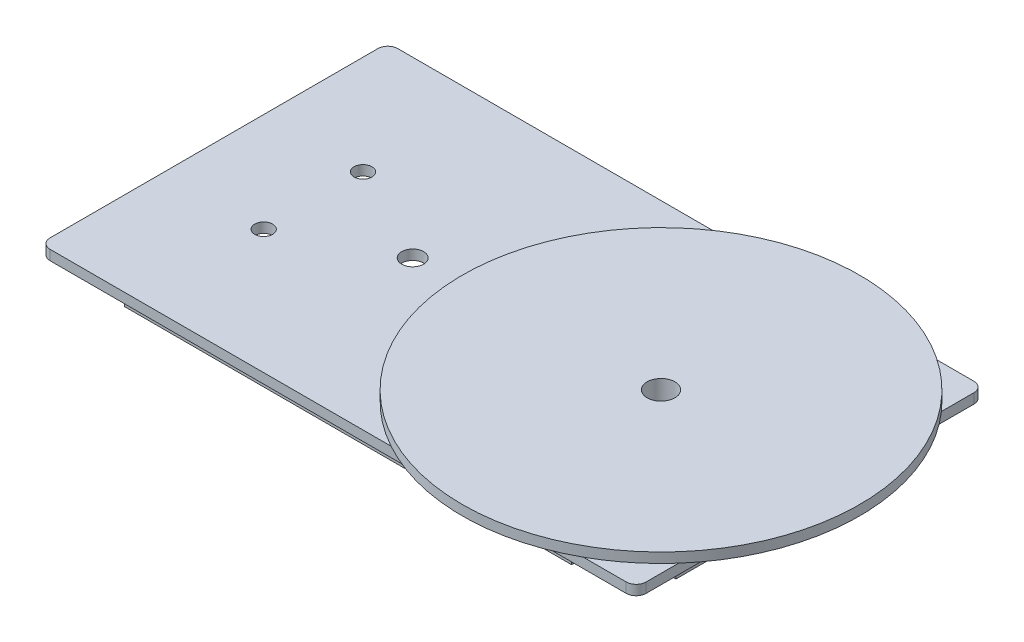
ISO-10303-21;
HEADER;
FILE_DESCRIPTION(('STEP AP214'),'2;1');
FILE_NAME('part.step','',(''),(''),'','','');
FILE_SCHEMA(('AUTOMOTIVE_DESIGN { 1 0 10303 214 1 1 1 1 }'));
ENDSEC;
DATA;
#1=APPLICATION_CONTEXT('core data for automotive mechanical design processes');
#2=APPLICATION_PROTOCOL_DEFINITION('international standard','automotive_design',2000,#1);
#3=PRODUCT_CONTEXT('',#1,'mechanical');
#4=PRODUCT('Part','Part','',(#3));
#5=PRODUCT_RELATED_PRODUCT_CATEGORY('part','',(#4));
#6=PRODUCT_DEFINITION_FORMATION('','',#4);
#7=PRODUCT_DEFINITION_CONTEXT('part definition',#1,'design');
#8=PRODUCT_DEFINITION('design','',#6,#7);
#9=PRODUCT_DEFINITION_SHAPE('','',#8);
#10=(LENGTH_UNIT() NAMED_UNIT(*) SI_UNIT(.MILLI.,.METRE.));
#11=(NAMED_UNIT(*) PLANE_ANGLE_UNIT() SI_UNIT($,.RADIAN.));
#12=(NAMED_UNIT(*) SI_UNIT($,.STERADIAN.) SOLID_ANGLE_UNIT());
#13=UNCERTAINTY_MEASURE_WITH_UNIT(LENGTH_MEASURE(1.E-05),#10,'distance_accuracy_value','');
#14=(GEOMETRIC_REPRESENTATION_CONTEXT(3) GLOBAL_UNCERTAINTY_ASSIGNED_CONTEXT((#13)) GLOBAL_UNIT_ASSIGNED_CONTEXT((#10,
#11,#12)) REPRESENTATION_CONTEXT('',''));
#15=CARTESIAN_POINT('',(0.,0.,0.));
#16=DIRECTION('',(0.,0.,1.));
#17=DIRECTION('',(1.,0.,0.));
#18=AXIS2_PLACEMENT_3D('',#15,#16,#17);
#19=CARTESIAN_POINT('',(0.,2.54,0.));
#20=DIRECTION('',(0.,-1.,0.));
#21=DIRECTION('',(0.,0.,-1.));
#22=AXIS2_PLACEMENT_3D('',#19,#20,#21);
#23=PLANE('',#22);
#24=CARTESIAN_POINT('',(38.1,2.54,0.));
#25=DIRECTION('',(0.,1.,0.));
#26=DIRECTION('',(0.,0.,1.));
#27=AXIS2_PLACEMENT_3D('',#24,#25,#26);
#28=CIRCLE('',#27,50.8);
#29=CARTESIAN_POINT('',(62.6934442484172,2.54,44.45));
#30=VERTEX_POINT('',#29);
#31=CARTESIAN_POINT('',(76.2,2.54,33.6010416505203));
#32=VERTEX_POINT('',#31);
#33=EDGE_CURVE('E283',#30,#32,#28,.T.);
#34=ORIENTED_EDGE('',*,*,#33,.F.);
#35=DIRECTION('',(1.,0.,0.));
#36=VECTOR('',#35,1.);
#37=CARTESIAN_POINT('',(-76.2,2.54,44.45));
#38=LINE('',#37,#36);
#39=CARTESIAN_POINT('',(73.6599999999999,2.54,44.45));
#40=VERTEX_POINT('',#39);
#41=EDGE_CURVE('E266',#30,#40,#38,.T.);
#42=ORIENTED_EDGE('',*,*,#41,.T.);
#43=CARTESIAN_POINT('',(73.66,2.54,41.91));
#44=DIRECTION('',(0.,-1.,0.));
#45=DIRECTION('',(0.,0.,-1.));
#46=AXIS2_PLACEMENT_3D('',#43,#44,#45);
#47=CIRCLE('',#46,2.54);
#48=CARTESIAN_POINT('',(76.2,2.54,41.91));
#49=VERTEX_POINT('',#48);
#50=EDGE_CURVE('E384',#40,#49,#47,.F.);
#51=ORIENTED_EDGE('',*,*,#50,.T.);
#52=DIRECTION('',(0.,0.,-1.));
#53=VECTOR('',#52,1.);
#54=CARTESIAN_POINT('',(76.2,2.54,44.45));
#55=LINE('',#54,#53);
#56=EDGE_CURVE('E422',#49,#32,#55,.T.);
#57=ORIENTED_EDGE('',*,*,#56,.T.);
#58=EDGE_LOOP('',(#34,#42,#51,#57));
#59=FACE_BOUND('',#58,.T.);
#60=ADVANCED_FACE('F68',(#59),#23,.F.);
#61=CARTESIAN_POINT('',(76.2,2.54,-33.6010416505203));
#62=VERTEX_POINT('',#61);
#63=CARTESIAN_POINT('',(62.6934442484171,2.54,-44.45));
#64=VERTEX_POINT('',#63);
#65=EDGE_CURVE('E12',#62,#64,#28,.T.);
#66=ORIENTED_EDGE('',*,*,#65,.F.);
#67=CARTESIAN_POINT('',(76.2,2.54,-41.91));
#68=VERTEX_POINT('',#67);
#69=EDGE_CURVE('E416',#62,#68,#55,.T.);
#70=ORIENTED_EDGE('',*,*,#69,.T.);
#71=CARTESIAN_POINT('',(73.66,2.54,-41.91));
#72=DIRECTION('',(0.,-1.,0.));
#73=DIRECTION('',(0.,0.,-1.));
#74=AXIS2_PLACEMENT_3D('',#71,#72,#73);
#75=CIRCLE('',#74,2.54);
#76=CARTESIAN_POINT('',(73.6599999999999,2.54,-44.45));
#77=VERTEX_POINT('',#76);
#78=EDGE_CURVE('E388',#68,#77,#75,.F.);
#79=ORIENTED_EDGE('',*,*,#78,.T.);
#80=DIRECTION('',(-1.,0.,0.));
#81=VECTOR('',#80,1.);
#82=CARTESIAN_POINT('',(-76.2,2.54,-44.45));
#83=LINE('',#82,#81);
#84=EDGE_CURVE('E459',#77,#64,#83,.T.);
#85=ORIENTED_EDGE('',*,*,#84,.T.);
#86=EDGE_LOOP('',(#66,#70,#79,#85));
#87=FACE_BOUND('',#86,.T.);
#88=ADVANCED_FACE('F331',(#87),#23,.F.);
#89=CARTESIAN_POINT('',(0.,0.,0.));
#90=DIRECTION('',(0.,-1.,0.));
#91=DIRECTION('',(0.,0.,-1.));
#92=AXIS2_PLACEMENT_3D('',#89,#90,#91);
#93=PLANE('',#92);
#94=CARTESIAN_POINT('',(38.1,0.,0.));
#95=DIRECTION('',(0.,-1.,0.));
#96=DIRECTION('',(0.,0.,-1.));
#97=AXIS2_PLACEMENT_3D('',#94,#95,#96);
#98=CIRCLE('',#97,3.556);
#99=CARTESIAN_POINT('',(38.1,0.,-3.55599999999999));
#100=VERTEX_POINT('',#99);
#101=EDGE_CURVE('E282',#100,#100,#98,.T.);
#102=ORIENTED_EDGE('',*,*,#101,.F.);
#103=EDGE_LOOP('',(#102));
#104=FACE_BOUND('',#103,.T.);
#105=CARTESIAN_POINT('',(-50.8,0.,12.7));
#106=DIRECTION('',(0.,-1.,0.));
#107=DIRECTION('',(0.,0.,-1.));
#108=AXIS2_PLACEMENT_3D('',#105,#106,#107);
#109=CIRCLE('',#108,2.28599999999999);
#110=CARTESIAN_POINT('',(-50.8,0.,10.414));
#111=VERTEX_POINT('',#110);
#112=EDGE_CURVE('E646',#111,#111,#109,.F.);
#113=ORIENTED_EDGE('',*,*,#112,.T.);
#114=EDGE_LOOP('',(#113));
#115=FACE_BOUND('',#114,.T.);
#116=CARTESIAN_POINT('',(-25.4,0.,0.));
#117=DIRECTION('',(0.,-1.,0.));
#118=DIRECTION('',(0.,0.,-1.));
#119=AXIS2_PLACEMENT_3D('',#116,#117,#118);
#120=CIRCLE('',#119,2.794);
#121=CARTESIAN_POINT('',(-25.4,0.,-2.79399999999999));
#122=VERTEX_POINT('',#121);
#123=EDGE_CURVE('E638',#122,#122,#120,.F.);
#124=ORIENTED_EDGE('',*,*,#123,.T.);
#125=EDGE_LOOP('',(#124));
#126=FACE_BOUND('',#125,.T.);
#127=DIRECTION('',(0.,0.,1.));
#128=VECTOR('',#127,1.);
#129=CARTESIAN_POINT('',(-76.2,0.,44.45));
#130=LINE('',#129,#128);
#131=CARTESIAN_POINT('',(-76.2,0.,-41.91));
#132=VERTEX_POINT('',#131);
#133=CARTESIAN_POINT('',(-76.2,0.,41.91));
#134=VERTEX_POINT('',#133);
#135=EDGE_CURVE('E417',#132,#134,#130,.T.);
#136=ORIENTED_EDGE('',*,*,#135,.F.);
#137=CARTESIAN_POINT('',(-73.66,0.,-41.91));
#138=DIRECTION('',(0.,-1.,0.));
#139=DIRECTION('',(0.,0.,-1.));
#140=AXIS2_PLACEMENT_3D('',#137,#138,#139);
#141=CIRCLE('',#140,2.54);
#142=CARTESIAN_POINT('',(-73.66,0.,-44.45));
#143=VERTEX_POINT('',#142);
#144=EDGE_CURVE('E440',#132,#143,#141,.T.);
#145=ORIENTED_EDGE('',*,*,#144,.T.);
#146=DIRECTION('',(-1.,0.,0.));
#147=VECTOR('',#146,1.);
#148=CARTESIAN_POINT('',(-76.2,0.,-44.45));
#149=LINE('',#148,#147);
#150=CARTESIAN_POINT('',(73.6599999999999,0.,-44.45));
#151=VERTEX_POINT('',#150);
#152=EDGE_CURVE('E423',#151,#143,#149,.T.);
#153=ORIENTED_EDGE('',*,*,#152,.F.);
#154=CARTESIAN_POINT('',(73.66,0.,-41.91));
#155=DIRECTION('',(0.,-1.,0.));
#156=DIRECTION('',(0.,0.,-1.));
#157=AXIS2_PLACEMENT_3D('',#154,#155,#156);
#158=CIRCLE('',#157,2.54);
#159=CARTESIAN_POINT('',(76.2,0.,-41.91));
#160=VERTEX_POINT('',#159);
#161=EDGE_CURVE('E437',#151,#160,#158,.T.);
#162=ORIENTED_EDGE('',*,*,#161,.T.);
#163=DIRECTION('',(0.,0.,-1.));
#164=VECTOR('',#163,1.);
#165=CARTESIAN_POINT('',(76.2,0.,44.45));
#166=LINE('',#165,#164);
#167=CARTESIAN_POINT('',(76.2,0.,41.91));
#168=VERTEX_POINT('',#167);
#169=EDGE_CURVE('E466',#168,#160,#166,.T.);
#170=ORIENTED_EDGE('',*,*,#169,.F.);
#171=CARTESIAN_POINT('',(73.66,0.,41.91));
#172=DIRECTION('',(0.,-1.,0.));
#173=DIRECTION('',(0.,0.,-1.));
#174=AXIS2_PLACEMENT_3D('',#171,#172,#173);
#175=CIRCLE('',#174,2.54);
#176=CARTESIAN_POINT('',(73.6599999999999,0.,44.45));
#177=VERTEX_POINT('',#176);
#178=EDGE_CURVE('E414',#168,#177,#175,.T.);
#179=ORIENTED_EDGE('',*,*,#178,.T.);
#180=DIRECTION('',(1.,0.,0.));
#181=VECTOR('',#180,1.);
#182=CARTESIAN_POINT('',(-76.2,0.,44.45));
#183=LINE('',#182,#181);
#184=CARTESIAN_POINT('',(-73.66,0.,44.45));
#185=VERTEX_POINT('',#184);
#186=EDGE_CURVE('E407',#185,#177,#183,.T.);
#187=ORIENTED_EDGE('',*,*,#186,.F.);
#188=CARTESIAN_POINT('',(-73.66,0.,41.91));
#189=DIRECTION('',(0.,-1.,0.));
#190=DIRECTION('',(0.,0.,-1.));
#191=AXIS2_PLACEMENT_3D('',#188,#189,#190);
#192=CIRCLE('',#191,2.54);
#193=EDGE_CURVE('E411',#185,#134,#192,.T.);
#194=ORIENTED_EDGE('',*,*,#193,.T.);
#195=EDGE_LOOP('',(#136,#145,#153,#162,#170,#179,#187,#194));
#196=FACE_BOUND('',#195,.T.);
#197=DIRECTION('',(0.,0.,1.));
#198=VECTOR('',#197,1.);
#199=CARTESIAN_POINT('',(57.15,0.,-41.91));
#200=LINE('',#199,#198);
#201=CARTESIAN_POINT('',(57.15,0.,-41.91));
#202=VERTEX_POINT('',#201);
#203=CARTESIAN_POINT('',(57.15,0.,-39.37));
#204=VERTEX_POINT('',#203);
#205=EDGE_CURVE('E597',#202,#204,#200,.T.);
#206=ORIENTED_EDGE('',*,*,#205,.F.);
#207=DIRECTION('',(1.,0.,0.));
#208=VECTOR('',#207,1.);
#209=CARTESIAN_POINT('',(57.15,0.,-41.91));
#210=LINE('',#209,#208);
#211=CARTESIAN_POINT('',(-57.15,0.,-41.91));
#212=VERTEX_POINT('',#211);
#213=EDGE_CURVE('E593',#212,#202,#210,.T.);
#214=ORIENTED_EDGE('',*,*,#213,.F.);
#215=DIRECTION('',(0.,0.,-1.));
#216=VECTOR('',#215,1.);
#217=CARTESIAN_POINT('',(-57.15,0.,-41.91));
#218=LINE('',#217,#216);
#219=CARTESIAN_POINT('',(-57.15,0.,-39.37));
#220=VERTEX_POINT('',#219);
#221=EDGE_CURVE('E604',#220,#212,#218,.T.);
#222=ORIENTED_EDGE('',*,*,#221,.F.);
#223=DIRECTION('',(-1.,0.,0.));
#224=VECTOR('',#223,1.);
#225=CARTESIAN_POINT('',(-57.15,0.,-39.37));
#226=LINE('',#225,#224);
#227=EDGE_CURVE('E600',#204,#220,#226,.T.);
#228=ORIENTED_EDGE('',*,*,#227,.F.);
#229=EDGE_LOOP('',(#206,#214,#222,#228));
#230=FACE_BOUND('',#229,.T.);
#231=DIRECTION('',(0.,0.,1.));
#232=VECTOR('',#231,1.);
#233=CARTESIAN_POINT('',(57.15,0.,41.91));
#234=LINE('',#233,#232);
#235=CARTESIAN_POINT('',(57.15,0.,39.37));
#236=VERTEX_POINT('',#235);
#237=CARTESIAN_POINT('',(57.15,0.,41.91));
#238=VERTEX_POINT('',#237);
#239=EDGE_CURVE('E556',#236,#238,#234,.T.);
#240=ORIENTED_EDGE('',*,*,#239,.F.);
#241=DIRECTION('',(1.,0.,0.));
#242=VECTOR('',#241,1.);
#243=CARTESIAN_POINT('',(-57.15,0.,39.37));
#244=LINE('',#243,#242);
#245=CARTESIAN_POINT('',(-57.15,0.,39.37));
#246=VERTEX_POINT('',#245);
#247=EDGE_CURVE('E552',#246,#236,#244,.T.);
#248=ORIENTED_EDGE('',*,*,#247,.F.);
#249=DIRECTION('',(0.,0.,-1.));
#250=VECTOR('',#249,1.);
#251=CARTESIAN_POINT('',(-57.15,0.,41.91));
#252=LINE('',#251,#250);
#253=CARTESIAN_POINT('',(-57.15,0.,41.91));
#254=VERTEX_POINT('',#253);
#255=EDGE_CURVE('E563',#254,#246,#252,.T.);
#256=ORIENTED_EDGE('',*,*,#255,.F.);
#257=DIRECTION('',(-1.,0.,0.));
#258=VECTOR('',#257,1.);
#259=CARTESIAN_POINT('',(57.15,0.,41.91));
#260=LINE('',#259,#258);
#261=EDGE_CURVE('E559',#238,#254,#260,.T.);
#262=ORIENTED_EDGE('',*,*,#261,.F.);
#263=EDGE_LOOP('',(#240,#248,#256,#262));
#264=FACE_BOUND('',#263,.T.);
#265=DIRECTION('',(-1.,0.,0.));
#266=VECTOR('',#265,1.);
#267=CARTESIAN_POINT('',(73.66,0.,31.75));
#268=LINE('',#267,#266);
#269=CARTESIAN_POINT('',(73.66,0.,31.75));
#270=VERTEX_POINT('',#269);
#271=CARTESIAN_POINT('',(71.12,0.,31.75));
#272=VERTEX_POINT('',#271);
#273=EDGE_CURVE('E515',#270,#272,#268,.T.);
#274=ORIENTED_EDGE('',*,*,#273,.F.);
#275=DIRECTION('',(0.,0.,1.));
#276=VECTOR('',#275,1.);
#277=CARTESIAN_POINT('',(73.66,0.,-31.75));
#278=LINE('',#277,#276);
#279=CARTESIAN_POINT('',(73.66,0.,-31.75));
#280=VERTEX_POINT('',#279);
#281=EDGE_CURVE('E511',#280,#270,#278,.T.);
#282=ORIENTED_EDGE('',*,*,#281,.F.);
#283=DIRECTION('',(1.,0.,0.));
#284=VECTOR('',#283,1.);
#285=CARTESIAN_POINT('',(73.66,0.,-31.75));
#286=LINE('',#285,#284);
#287=CARTESIAN_POINT('',(71.12,0.,-31.75));
#288=VERTEX_POINT('',#287);
#289=EDGE_CURVE('E522',#288,#280,#286,.T.);
#290=ORIENTED_EDGE('',*,*,#289,.F.);
#291=DIRECTION('',(0.,0.,-1.));
#292=VECTOR('',#291,1.);
#293=CARTESIAN_POINT('',(71.12,0.,31.75));
#294=LINE('',#293,#292);
#295=EDGE_CURVE('E518',#272,#288,#294,.T.);
#296=ORIENTED_EDGE('',*,*,#295,.F.);
#297=EDGE_LOOP('',(#274,#282,#290,#296));
#298=FACE_BOUND('',#297,.T.);
#299=DIRECTION('',(-1.,0.,0.));
#300=VECTOR('',#299,1.);
#301=CARTESIAN_POINT('',(-73.66,0.,31.75));
#302=LINE('',#301,#300);
#303=CARTESIAN_POINT('',(-71.12,0.,31.75));
#304=VERTEX_POINT('',#303);
#305=CARTESIAN_POINT('',(-73.66,0.,31.75));
#306=VERTEX_POINT('',#305);
#307=EDGE_CURVE('E504',#304,#306,#302,.T.);
#308=ORIENTED_EDGE('',*,*,#307,.F.);
#309=DIRECTION('',(0.,0.,1.));
#310=VECTOR('',#309,1.);
#311=CARTESIAN_POINT('',(-71.12,0.,31.75));
#312=LINE('',#311,#310);
#313=CARTESIAN_POINT('',(-71.12,0.,-31.75));
#314=VERTEX_POINT('',#313);
#315=EDGE_CURVE('E507',#314,#304,#312,.T.);
#316=ORIENTED_EDGE('',*,*,#315,.F.);
#317=DIRECTION('',(1.,0.,0.));
#318=VECTOR('',#317,1.);
#319=CARTESIAN_POINT('',(-73.66,0.,-31.75));
#320=LINE('',#319,#318);
#321=CARTESIAN_POINT('',(-73.66,0.,-31.75));
#322=VERTEX_POINT('',#321);
#323=EDGE_CURVE('E497',#322,#314,#320,.T.);
#324=ORIENTED_EDGE('',*,*,#323,.F.);
#325=DIRECTION('',(0.,0.,-1.));
#326=VECTOR('',#325,1.);
#327=CARTESIAN_POINT('',(-73.66,0.,-31.75));
#328=LINE('',#327,#326);
#329=EDGE_CURVE('E500',#306,#322,#328,.T.);
#330=ORIENTED_EDGE('',*,*,#329,.F.);
#331=EDGE_LOOP('',(#308,#316,#324,#330));
#332=FACE_BOUND('',#331,.T.);
#333=CARTESIAN_POINT('',(-50.8,0.,-12.7));
#334=DIRECTION('',(0.,-1.,0.));
#335=DIRECTION('',(0.,0.,-1.));
#336=AXIS2_PLACEMENT_3D('',#333,#334,#335);
#337=CIRCLE('',#336,2.28599999999999);
#338=CARTESIAN_POINT('',(-50.8,0.,-14.986));
#339=VERTEX_POINT('',#338);
#340=EDGE_CURVE('E642',#339,#339,#337,.T.);
#341=ORIENTED_EDGE('',*,*,#340,.F.);
#342=EDGE_LOOP('',(#341));
#343=FACE_BOUND('',#342,.T.);
#344=ADVANCED_FACE('F338',(#104,#115,#126,#196,#230,#264,#298,#332,#343),#93,.T.);
#345=CARTESIAN_POINT('',(13.5065557515829,2.54,-44.45));
#346=VERTEX_POINT('',#345);
#347=CARTESIAN_POINT('',(13.5065557515828,2.54,44.45));
#348=VERTEX_POINT('',#347);
#349=EDGE_CURVE('E78',#346,#348,#28,.T.);
#350=ORIENTED_EDGE('',*,*,#349,.F.);
#351=CARTESIAN_POINT('',(-73.66,2.54,-44.45));
#352=VERTEX_POINT('',#351);
#353=EDGE_CURVE('E451',#346,#352,#83,.T.);
#354=ORIENTED_EDGE('',*,*,#353,.T.);
#355=CARTESIAN_POINT('',(-73.66,2.54,-41.91));
#356=DIRECTION('',(0.,-1.,0.));
#357=DIRECTION('',(0.,0.,-1.));
#358=AXIS2_PLACEMENT_3D('',#355,#356,#357);
#359=CIRCLE('',#358,2.54);
#360=CARTESIAN_POINT('',(-76.2,2.54,-41.91));
#361=VERTEX_POINT('',#360);
#362=EDGE_CURVE('E392',#352,#361,#359,.F.);
#363=ORIENTED_EDGE('',*,*,#362,.T.);
#364=DIRECTION('',(0.,0.,1.));
#365=VECTOR('',#364,1.);
#366=CARTESIAN_POINT('',(-76.2,2.54,44.45));
#367=LINE('',#366,#365);
#368=CARTESIAN_POINT('',(-76.2,2.54,41.91));
#369=VERTEX_POINT('',#368);
#370=EDGE_CURVE('E456',#361,#369,#367,.T.);
#371=ORIENTED_EDGE('',*,*,#370,.T.);
#372=CARTESIAN_POINT('',(-73.66,2.54,41.91));
#373=DIRECTION('',(0.,-1.,0.));
#374=DIRECTION('',(0.,0.,-1.));
#375=AXIS2_PLACEMENT_3D('',#372,#373,#374);
#376=CIRCLE('',#375,2.54);
#377=CARTESIAN_POINT('',(-73.66,2.54,44.45));
#378=VERTEX_POINT('',#377);
#379=EDGE_CURVE('E258',#369,#378,#376,.F.);
#380=ORIENTED_EDGE('',*,*,#379,.T.);
#381=EDGE_CURVE('E250',#378,#348,#38,.T.);
#382=ORIENTED_EDGE('',*,*,#381,.T.);
#383=EDGE_LOOP('',(#350,#354,#363,#371,#380,#382));
#384=FACE_BOUND('',#383,.T.);
#385=CARTESIAN_POINT('',(-25.4,2.54,0.));
#386=DIRECTION('',(0.,1.,0.));
#387=DIRECTION('',(0.,0.,1.));
#388=AXIS2_PLACEMENT_3D('',#385,#386,#387);
#389=CIRCLE('',#388,2.794);
#390=CARTESIAN_POINT('',(-25.4,2.54,2.79400000000001));
#391=VERTEX_POINT('',#390);
#392=EDGE_CURVE('E634',#391,#391,#389,.T.);
#393=ORIENTED_EDGE('',*,*,#392,.F.);
#394=EDGE_LOOP('',(#393));
#395=FACE_BOUND('',#394,.T.);
#396=CARTESIAN_POINT('',(-50.8,2.54,12.7));
#397=DIRECTION('',(0.,-1.,0.));
#398=DIRECTION('',(0.,0.,-1.));
#399=AXIS2_PLACEMENT_3D('',#396,#397,#398);
#400=CIRCLE('',#399,2.28599999999999);
#401=CARTESIAN_POINT('',(-50.8,2.54,10.414));
#402=VERTEX_POINT('',#401);
#403=EDGE_CURVE('E299',#402,#402,#400,.T.);
#404=ORIENTED_EDGE('',*,*,#403,.T.);
#405=EDGE_LOOP('',(#404));
#406=FACE_BOUND('',#405,.T.);
#407=CARTESIAN_POINT('',(-50.8,2.54,-12.7));
#408=DIRECTION('',(0.,1.,0.));
#409=DIRECTION('',(0.,0.,1.));
#410=AXIS2_PLACEMENT_3D('',#407,#408,#409);
#411=CIRCLE('',#410,2.28599999999999);
#412=CARTESIAN_POINT('',(-50.8,2.54,-10.414));
#413=VERTEX_POINT('',#412);
#414=EDGE_CURVE('E650',#413,#413,#411,.T.);
#415=ORIENTED_EDGE('',*,*,#414,.F.);
#416=EDGE_LOOP('',(#415));
#417=FACE_BOUND('',#416,.T.);
#418=ADVANCED_FACE('F252',(#384,#395,#406,#417),#23,.F.);
#419=CARTESIAN_POINT('',(76.2,2.54,44.45));
#420=DIRECTION('',(-1.,0.,0.));
#421=DIRECTION('',(0.,0.,1.));
#422=AXIS2_PLACEMENT_3D('',#419,#420,#421);
#423=PLANE('',#422);
#424=ORIENTED_EDGE('',*,*,#169,.T.);
#425=DIRECTION('',(0.,-1.,0.));
#426=VECTOR('',#425,1.);
#427=CARTESIAN_POINT('',(76.2,2.54,-41.91));
#428=LINE('',#427,#426);
#429=EDGE_CURVE('E402',#160,#68,#428,.F.);
#430=ORIENTED_EDGE('',*,*,#429,.T.);
#431=ORIENTED_EDGE('',*,*,#69,.F.);
#432=EDGE_CURVE('E92',#32,#62,#55,.T.);
#433=ORIENTED_EDGE('',*,*,#432,.F.);
#434=ORIENTED_EDGE('',*,*,#56,.F.);
#435=DIRECTION('',(0.,-1.,0.));
#436=VECTOR('',#435,1.);
#437=CARTESIAN_POINT('',(76.2,2.54,41.91));
#438=LINE('',#437,#436);
#439=EDGE_CURVE('E386',#49,#168,#438,.T.);
#440=ORIENTED_EDGE('',*,*,#439,.T.);
#441=EDGE_LOOP('',(#424,#430,#431,#433,#434,#440));
#442=FACE_BOUND('',#441,.T.);
#443=ADVANCED_FACE('F342',(#442),#423,.F.);
#444=CARTESIAN_POINT('',(-76.2,2.54,-44.45));
#445=DIRECTION('',(0.,0.,1.));
#446=DIRECTION('',(1.,0.,0.));
#447=AXIS2_PLACEMENT_3D('',#444,#445,#446);
#448=PLANE('',#447);
#449=ORIENTED_EDGE('',*,*,#152,.T.);
#450=DIRECTION('',(0.,-1.,0.));
#451=VECTOR('',#450,1.);
#452=CARTESIAN_POINT('',(-73.66,2.54,-44.45));
#453=LINE('',#452,#451);
#454=EDGE_CURVE('E394',#143,#352,#453,.F.);
#455=ORIENTED_EDGE('',*,*,#454,.T.);
#456=ORIENTED_EDGE('',*,*,#353,.F.);
#457=EDGE_CURVE('E463',#64,#346,#83,.T.);
#458=ORIENTED_EDGE('',*,*,#457,.F.);
#459=ORIENTED_EDGE('',*,*,#84,.F.);
#460=DIRECTION('',(0.,-1.,0.));
#461=VECTOR('',#460,1.);
#462=CARTESIAN_POINT('',(73.66,2.54,-44.45));
#463=LINE('',#462,#461);
#464=EDGE_CURVE('E443',#77,#151,#463,.T.);
#465=ORIENTED_EDGE('',*,*,#464,.T.);
#466=EDGE_LOOP('',(#449,#455,#456,#458,#459,#465));
#467=FACE_BOUND('',#466,.T.);
#468=ADVANCED_FACE('F346',(#467),#448,.F.);
#469=CARTESIAN_POINT('',(-76.2,2.54,44.45));
#470=DIRECTION('',(1.,0.,0.));
#471=DIRECTION('',(0.,0.,-1.));
#472=AXIS2_PLACEMENT_3D('',#469,#470,#471);
#473=PLANE('',#472);
#474=ORIENTED_EDGE('',*,*,#370,.F.);
#475=DIRECTION('',(0.,-1.,0.));
#476=VECTOR('',#475,1.);
#477=CARTESIAN_POINT('',(-76.2,2.54,-41.91));
#478=LINE('',#477,#476);
#479=EDGE_CURVE('E429',#361,#132,#478,.T.);
#480=ORIENTED_EDGE('',*,*,#479,.T.);
#481=ORIENTED_EDGE('',*,*,#135,.T.);
#482=DIRECTION('',(0.,-1.,0.));
#483=VECTOR('',#482,1.);
#484=CARTESIAN_POINT('',(-76.2,2.54,41.91));
#485=LINE('',#484,#483);
#486=EDGE_CURVE('E263',#134,#369,#485,.F.);
#487=ORIENTED_EDGE('',*,*,#486,.T.);
#488=EDGE_LOOP('',(#474,#480,#481,#487));
#489=FACE_BOUND('',#488,.T.);
#490=ADVANCED_FACE('F358',(#489),#473,.F.);
#491=CARTESIAN_POINT('',(-76.2,2.54,44.45));
#492=DIRECTION('',(0.,0.,-1.));
#493=DIRECTION('',(-1.,0.,0.));
#494=AXIS2_PLACEMENT_3D('',#491,#492,#493);
#495=PLANE('',#494);
#496=ORIENTED_EDGE('',*,*,#186,.T.);
#497=DIRECTION('',(0.,-1.,0.));
#498=VECTOR('',#497,1.);
#499=CARTESIAN_POINT('',(73.66,2.54,44.45));
#500=LINE('',#499,#498);
#501=EDGE_CURVE('E72',#177,#40,#500,.F.);
#502=ORIENTED_EDGE('',*,*,#501,.T.);
#503=ORIENTED_EDGE('',*,*,#41,.F.);
#504=EDGE_CURVE('E264',#348,#30,#38,.T.);
#505=ORIENTED_EDGE('',*,*,#504,.F.);
#506=ORIENTED_EDGE('',*,*,#381,.F.);
#507=DIRECTION('',(0.,-1.,0.));
#508=VECTOR('',#507,1.);
#509=CARTESIAN_POINT('',(-73.66,2.54,44.45));
#510=LINE('',#509,#508);
#511=EDGE_CURVE('E290',#378,#185,#510,.T.);
#512=ORIENTED_EDGE('',*,*,#511,.T.);
#513=EDGE_LOOP('',(#496,#502,#503,#505,#506,#512));
#514=FACE_BOUND('',#513,.T.);
#515=ADVANCED_FACE('F271',(#514),#495,.F.);
#516=CARTESIAN_POINT('',(57.15,-3.175,-41.91));
#517=DIRECTION('',(0.,0.,1.));
#518=DIRECTION('',(1.,0.,0.));
#519=AXIS2_PLACEMENT_3D('',#516,#517,#518);
#520=PLANE('',#519);
#521=ORIENTED_EDGE('',*,*,#213,.T.);
#522=DIRECTION('',(0.,1.,0.));
#523=VECTOR('',#522,1.);
#524=CARTESIAN_POINT('',(57.15,-3.175,-41.91));
#525=LINE('',#524,#523);
#526=CARTESIAN_POINT('',(57.15,-3.175,-41.91));
#527=VERTEX_POINT('',#526);
#528=EDGE_CURVE('E631',#527,#202,#525,.T.);
#529=ORIENTED_EDGE('',*,*,#528,.F.);
#530=DIRECTION('',(1.,0.,0.));
#531=VECTOR('',#530,1.);
#532=CARTESIAN_POINT('',(57.15,-3.175,-41.91));
#533=LINE('',#532,#531);
#534=CARTESIAN_POINT('',(-57.15,-3.175,-41.91));
#535=VERTEX_POINT('',#534);
#536=EDGE_CURVE('E607',#535,#527,#533,.T.);
#537=ORIENTED_EDGE('',*,*,#536,.F.);
#538=DIRECTION('',(0.,1.,0.));
#539=VECTOR('',#538,1.);
#540=CARTESIAN_POINT('',(-57.15,-3.175,-41.91));
#541=LINE('',#540,#539);
#542=EDGE_CURVE('E620',#535,#212,#541,.T.);
#543=ORIENTED_EDGE('',*,*,#542,.T.);
#544=EDGE_LOOP('',(#521,#529,#537,#543));
#545=FACE_BOUND('',#544,.T.);
#546=ADVANCED_FACE('F357',(#545),#520,.F.);
#547=CARTESIAN_POINT('',(57.15,-3.175,-41.91));
#548=DIRECTION('',(-1.,0.,0.));
#549=DIRECTION('',(0.,0.,1.));
#550=AXIS2_PLACEMENT_3D('',#547,#548,#549);
#551=PLANE('',#550);
#552=ORIENTED_EDGE('',*,*,#205,.T.);
#553=DIRECTION('',(0.,1.,0.));
#554=VECTOR('',#553,1.);
#555=CARTESIAN_POINT('',(57.15,-3.175,-39.37));
#556=LINE('',#555,#554);
#557=CARTESIAN_POINT('',(57.15,-3.175,-39.37));
#558=VERTEX_POINT('',#557);
#559=EDGE_CURVE('E627',#558,#204,#556,.T.);
#560=ORIENTED_EDGE('',*,*,#559,.F.);
#561=DIRECTION('',(0.,0.,1.));
#562=VECTOR('',#561,1.);
#563=CARTESIAN_POINT('',(57.15,-3.175,-41.91));
#564=LINE('',#563,#562);
#565=EDGE_CURVE('E611',#527,#558,#564,.T.);
#566=ORIENTED_EDGE('',*,*,#565,.F.);
#567=ORIENTED_EDGE('',*,*,#528,.T.);
#568=EDGE_LOOP('',(#552,#560,#566,#567));
#569=FACE_BOUND('',#568,.T.);
#570=ADVANCED_FACE('F942',(#569),#551,.F.);
#571=CARTESIAN_POINT('',(-57.15,-3.175,-39.37));
#572=DIRECTION('',(0.,0.,-1.));
#573=DIRECTION('',(-1.,0.,0.));
#574=AXIS2_PLACEMENT_3D('',#571,#572,#573);
#575=PLANE('',#574);
#576=ORIENTED_EDGE('',*,*,#227,.T.);
#577=DIRECTION('',(0.,1.,0.));
#578=VECTOR('',#577,1.);
#579=CARTESIAN_POINT('',(-57.15,-3.175,-39.37));
#580=LINE('',#579,#578);
#581=CARTESIAN_POINT('',(-57.15,-3.175,-39.37));
#582=VERTEX_POINT('',#581);
#583=EDGE_CURVE('E624',#582,#220,#580,.T.);
#584=ORIENTED_EDGE('',*,*,#583,.F.);
#585=DIRECTION('',(-1.,0.,0.));
#586=VECTOR('',#585,1.);
#587=CARTESIAN_POINT('',(-57.15,-3.175,-39.37));
#588=LINE('',#587,#586);
#589=EDGE_CURVE('E614',#558,#582,#588,.T.);
#590=ORIENTED_EDGE('',*,*,#589,.F.);
#591=ORIENTED_EDGE('',*,*,#559,.T.);
#592=EDGE_LOOP('',(#576,#584,#590,#591));
#593=FACE_BOUND('',#592,.T.);
#594=ADVANCED_FACE('F933',(#593),#575,.F.);
#595=CARTESIAN_POINT('',(-57.15,-3.175,-41.91));
#596=DIRECTION('',(1.,0.,0.));
#597=DIRECTION('',(0.,0.,-1.));
#598=AXIS2_PLACEMENT_3D('',#595,#596,#597);
#599=PLANE('',#598);
#600=ORIENTED_EDGE('',*,*,#221,.T.);
#601=ORIENTED_EDGE('',*,*,#542,.F.);
#602=DIRECTION('',(0.,0.,-1.));
#603=VECTOR('',#602,1.);
#604=CARTESIAN_POINT('',(-57.15,-3.175,-41.91));
#605=LINE('',#604,#603);
#606=EDGE_CURVE('E617',#582,#535,#605,.T.);
#607=ORIENTED_EDGE('',*,*,#606,.F.);
#608=ORIENTED_EDGE('',*,*,#583,.T.);
#609=EDGE_LOOP('',(#600,#601,#607,#608));
#610=FACE_BOUND('',#609,.T.);
#611=ADVANCED_FACE('F925',(#610),#599,.F.);
#612=CARTESIAN_POINT('',(0.,-3.175,0.));
#613=DIRECTION('',(0.,1.,0.));
#614=DIRECTION('',(0.,0.,1.));
#615=AXIS2_PLACEMENT_3D('',#612,#613,#614);
#616=PLANE('',#615);
#617=ORIENTED_EDGE('',*,*,#536,.T.);
#618=ORIENTED_EDGE('',*,*,#565,.T.);
#619=ORIENTED_EDGE('',*,*,#589,.T.);
#620=ORIENTED_EDGE('',*,*,#606,.T.);
#621=EDGE_LOOP('',(#617,#618,#619,#620));
#622=FACE_BOUND('',#621,.T.);
#623=ADVANCED_FACE('F916',(#622),#616,.F.);
#624=CARTESIAN_POINT('',(-57.15,-3.175,39.37));
#625=DIRECTION('',(0.,0.,1.));
#626=DIRECTION('',(1.,0.,0.));
#627=AXIS2_PLACEMENT_3D('',#624,#625,#626);
#628=PLANE('',#627);
#629=ORIENTED_EDGE('',*,*,#247,.T.);
#630=DIRECTION('',(0.,1.,0.));
#631=VECTOR('',#630,1.);
#632=CARTESIAN_POINT('',(57.15,-3.175,39.37));
#633=LINE('',#632,#631);
#634=CARTESIAN_POINT('',(57.15,-3.175,39.37));
#635=VERTEX_POINT('',#634);
#636=EDGE_CURVE('E590',#635,#236,#633,.T.);
#637=ORIENTED_EDGE('',*,*,#636,.F.);
#638=DIRECTION('',(1.,0.,0.));
#639=VECTOR('',#638,1.);
#640=CARTESIAN_POINT('',(-57.15,-3.175,39.37));
#641=LINE('',#640,#639);
#642=CARTESIAN_POINT('',(-57.15,-3.175,39.37));
#643=VERTEX_POINT('',#642);
#644=EDGE_CURVE('E566',#643,#635,#641,.T.);
#645=ORIENTED_EDGE('',*,*,#644,.F.);
#646=DIRECTION('',(0.,1.,0.));
#647=VECTOR('',#646,1.);
#648=CARTESIAN_POINT('',(-57.15,-3.175,39.37));
#649=LINE('',#648,#647);
#650=EDGE_CURVE('E579',#643,#246,#649,.T.);
#651=ORIENTED_EDGE('',*,*,#650,.T.);
#652=EDGE_LOOP('',(#629,#637,#645,#651));
#653=FACE_BOUND('',#652,.T.);
#654=ADVANCED_FACE('F907',(#653),#628,.F.);
#655=CARTESIAN_POINT('',(57.15,-3.175,41.91));
#656=DIRECTION('',(-1.,0.,0.));
#657=DIRECTION('',(0.,0.,1.));
#658=AXIS2_PLACEMENT_3D('',#655,#656,#657);
#659=PLANE('',#658);
#660=ORIENTED_EDGE('',*,*,#239,.T.);
#661=DIRECTION('',(0.,1.,0.));
#662=VECTOR('',#661,1.);
#663=CARTESIAN_POINT('',(57.15,-3.175,41.91));
#664=LINE('',#663,#662);
#665=CARTESIAN_POINT('',(57.15,-3.175,41.91));
#666=VERTEX_POINT('',#665);
#667=EDGE_CURVE('E586',#666,#238,#664,.T.);
#668=ORIENTED_EDGE('',*,*,#667,.F.);
#669=DIRECTION('',(0.,0.,1.));
#670=VECTOR('',#669,1.);
#671=CARTESIAN_POINT('',(57.15,-3.175,41.91));
#672=LINE('',#671,#670);
#673=EDGE_CURVE('E570',#635,#666,#672,.T.);
#674=ORIENTED_EDGE('',*,*,#673,.F.);
#675=ORIENTED_EDGE('',*,*,#636,.T.);
#676=EDGE_LOOP('',(#660,#668,#674,#675));
#677=FACE_BOUND('',#676,.T.);
#678=ADVANCED_FACE('F898',(#677),#659,.F.);
#679=CARTESIAN_POINT('',(57.15,-3.175,41.91));
#680=DIRECTION('',(0.,0.,-1.));
#681=DIRECTION('',(-1.,0.,0.));
#682=AXIS2_PLACEMENT_3D('',#679,#680,#681);
#683=PLANE('',#682);
#684=ORIENTED_EDGE('',*,*,#261,.T.);
#685=DIRECTION('',(0.,1.,0.));
#686=VECTOR('',#685,1.);
#687=CARTESIAN_POINT('',(-57.15,-3.175,41.91));
#688=LINE('',#687,#686);
#689=CARTESIAN_POINT('',(-57.15,-3.175,41.91));
#690=VERTEX_POINT('',#689);
#691=EDGE_CURVE('E583',#690,#254,#688,.T.);
#692=ORIENTED_EDGE('',*,*,#691,.F.);
#693=DIRECTION('',(-1.,0.,0.));
#694=VECTOR('',#693,1.);
#695=CARTESIAN_POINT('',(57.15,-3.175,41.91));
#696=LINE('',#695,#694);
#697=EDGE_CURVE('E573',#666,#690,#696,.T.);
#698=ORIENTED_EDGE('',*,*,#697,.F.);
#699=ORIENTED_EDGE('',*,*,#667,.T.);
#700=EDGE_LOOP('',(#684,#692,#698,#699));
#701=FACE_BOUND('',#700,.T.);
#702=ADVANCED_FACE('F889',(#701),#683,.F.);
#703=CARTESIAN_POINT('',(-57.15,-3.175,41.91));
#704=DIRECTION('',(1.,0.,0.));
#705=DIRECTION('',(0.,0.,-1.));
#706=AXIS2_PLACEMENT_3D('',#703,#704,#705);
#707=PLANE('',#706);
#708=ORIENTED_EDGE('',*,*,#255,.T.);
#709=ORIENTED_EDGE('',*,*,#650,.F.);
#710=DIRECTION('',(0.,0.,-1.));
#711=VECTOR('',#710,1.);
#712=CARTESIAN_POINT('',(-57.15,-3.175,41.91));
#713=LINE('',#712,#711);
#714=EDGE_CURVE('E576',#690,#643,#713,.T.);
#715=ORIENTED_EDGE('',*,*,#714,.F.);
#716=ORIENTED_EDGE('',*,*,#691,.T.);
#717=EDGE_LOOP('',(#708,#709,#715,#716));
#718=FACE_BOUND('',#717,.T.);
#719=ADVANCED_FACE('F880',(#718),#707,.F.);
#720=CARTESIAN_POINT('',(0.,-3.175,0.));
#721=DIRECTION('',(0.,1.,0.));
#722=DIRECTION('',(0.,0.,1.));
#723=AXIS2_PLACEMENT_3D('',#720,#721,#722);
#724=PLANE('',#723);
#725=ORIENTED_EDGE('',*,*,#644,.T.);
#726=ORIENTED_EDGE('',*,*,#673,.T.);
#727=ORIENTED_EDGE('',*,*,#697,.T.);
#728=ORIENTED_EDGE('',*,*,#714,.T.);
#729=EDGE_LOOP('',(#725,#726,#727,#728));
#730=FACE_BOUND('',#729,.T.);
#731=ADVANCED_FACE('F871',(#730),#724,.F.);
#732=CARTESIAN_POINT('',(73.66,-3.175,-31.75));
#733=DIRECTION('',(-1.,0.,0.));
#734=DIRECTION('',(0.,0.,1.));
#735=AXIS2_PLACEMENT_3D('',#732,#733,#734);
#736=PLANE('',#735);
#737=ORIENTED_EDGE('',*,*,#281,.T.);
#738=DIRECTION('',(0.,1.,0.));
#739=VECTOR('',#738,1.);
#740=CARTESIAN_POINT('',(73.66,-3.175,31.75));
#741=LINE('',#740,#739);
#742=CARTESIAN_POINT('',(73.66,-3.175,31.75));
#743=VERTEX_POINT('',#742);
#744=EDGE_CURVE('E549',#743,#270,#741,.T.);
#745=ORIENTED_EDGE('',*,*,#744,.F.);
#746=DIRECTION('',(0.,0.,1.));
#747=VECTOR('',#746,1.);
#748=CARTESIAN_POINT('',(73.66,-3.175,-31.75));
#749=LINE('',#748,#747);
#750=CARTESIAN_POINT('',(73.66,-3.175,-31.75));
#751=VERTEX_POINT('',#750);
#752=EDGE_CURVE('E525',#751,#743,#749,.T.);
#753=ORIENTED_EDGE('',*,*,#752,.F.);
#754=DIRECTION('',(0.,1.,0.));
#755=VECTOR('',#754,1.);
#756=CARTESIAN_POINT('',(73.66,-3.175,-31.75));
#757=LINE('',#756,#755);
#758=EDGE_CURVE('E538',#751,#280,#757,.T.);
#759=ORIENTED_EDGE('',*,*,#758,.T.);
#760=EDGE_LOOP('',(#737,#745,#753,#759));
#761=FACE_BOUND('',#760,.T.);
#762=ADVANCED_FACE('F862',(#761),#736,.F.);
#763=CARTESIAN_POINT('',(73.66,-3.175,31.75));
#764=DIRECTION('',(0.,0.,-1.));
#765=DIRECTION('',(-1.,0.,0.));
#766=AXIS2_PLACEMENT_3D('',#763,#764,#765);
#767=PLANE('',#766);
#768=ORIENTED_EDGE('',*,*,#273,.T.);
#769=DIRECTION('',(0.,1.,0.));
#770=VECTOR('',#769,1.);
#771=CARTESIAN_POINT('',(71.12,-3.175,31.75));
#772=LINE('',#771,#770);
#773=CARTESIAN_POINT('',(71.12,-3.175,31.75));
#774=VERTEX_POINT('',#773);
#775=EDGE_CURVE('E545',#774,#272,#772,.T.);
#776=ORIENTED_EDGE('',*,*,#775,.F.);
#777=DIRECTION('',(-1.,0.,0.));
#778=VECTOR('',#777,1.);
#779=CARTESIAN_POINT('',(73.66,-3.175,31.75));
#780=LINE('',#779,#778);
#781=EDGE_CURVE('E529',#743,#774,#780,.T.);
#782=ORIENTED_EDGE('',*,*,#781,.F.);
#783=ORIENTED_EDGE('',*,*,#744,.T.);
#784=EDGE_LOOP('',(#768,#776,#782,#783));
#785=FACE_BOUND('',#784,.T.);
#786=ADVANCED_FACE('F853',(#785),#767,.F.);
#787=CARTESIAN_POINT('',(71.12,-3.175,31.75));
#788=DIRECTION('',(1.,0.,0.));
#789=DIRECTION('',(0.,0.,-1.));
#790=AXIS2_PLACEMENT_3D('',#787,#788,#789);
#791=PLANE('',#790);
#792=ORIENTED_EDGE('',*,*,#295,.T.);
#793=DIRECTION('',(0.,1.,0.));
#794=VECTOR('',#793,1.);
#795=CARTESIAN_POINT('',(71.12,-3.175,-31.75));
#796=LINE('',#795,#794);
#797=CARTESIAN_POINT('',(71.12,-3.175,-31.75));
#798=VERTEX_POINT('',#797);
#799=EDGE_CURVE('E542',#798,#288,#796,.T.);
#800=ORIENTED_EDGE('',*,*,#799,.F.);
#801=DIRECTION('',(0.,0.,-1.));
#802=VECTOR('',#801,1.);
#803=CARTESIAN_POINT('',(71.12,-3.175,31.75));
#804=LINE('',#803,#802);
#805=EDGE_CURVE('E532',#774,#798,#804,.T.);
#806=ORIENTED_EDGE('',*,*,#805,.F.);
#807=ORIENTED_EDGE('',*,*,#775,.T.);
#808=EDGE_LOOP('',(#792,#800,#806,#807));
#809=FACE_BOUND('',#808,.T.);
#810=ADVANCED_FACE('F844',(#809),#791,.F.);
#811=CARTESIAN_POINT('',(73.66,-3.175,-31.75));
#812=DIRECTION('',(0.,0.,1.));
#813=DIRECTION('',(1.,0.,0.));
#814=AXIS2_PLACEMENT_3D('',#811,#812,#813);
#815=PLANE('',#814);
#816=ORIENTED_EDGE('',*,*,#289,.T.);
#817=ORIENTED_EDGE('',*,*,#758,.F.);
#818=DIRECTION('',(1.,0.,0.));
#819=VECTOR('',#818,1.);
#820=CARTESIAN_POINT('',(73.66,-3.175,-31.75));
#821=LINE('',#820,#819);
#822=EDGE_CURVE('E535',#798,#751,#821,.T.);
#823=ORIENTED_EDGE('',*,*,#822,.F.);
#824=ORIENTED_EDGE('',*,*,#799,.T.);
#825=EDGE_LOOP('',(#816,#817,#823,#824));
#826=FACE_BOUND('',#825,.T.);
#827=ADVANCED_FACE('F835',(#826),#815,.F.);
#828=CARTESIAN_POINT('',(0.,-3.175,0.));
#829=DIRECTION('',(0.,-1.,0.));
#830=DIRECTION('',(0.,0.,-1.));
#831=AXIS2_PLACEMENT_3D('',#828,#829,#830);
#832=PLANE('',#831);
#833=ORIENTED_EDGE('',*,*,#752,.T.);
#834=ORIENTED_EDGE('',*,*,#781,.T.);
#835=ORIENTED_EDGE('',*,*,#805,.T.);
#836=ORIENTED_EDGE('',*,*,#822,.T.);
#837=EDGE_LOOP('',(#833,#834,#835,#836));
#838=FACE_BOUND('',#837,.T.);
#839=ADVANCED_FACE('F826',(#838),#832,.T.);
#840=CARTESIAN_POINT('',(-71.12,-3.175,31.75));
#841=DIRECTION('',(-1.,0.,0.));
#842=DIRECTION('',(0.,0.,1.));
#843=AXIS2_PLACEMENT_3D('',#840,#841,#842);
#844=PLANE('',#843);
#845=ORIENTED_EDGE('',*,*,#315,.T.);
#846=DIRECTION('',(0.,1.,0.));
#847=VECTOR('',#846,1.);
#848=CARTESIAN_POINT('',(-71.12,-3.175,31.75));
#849=LINE('',#848,#847);
#850=CARTESIAN_POINT('',(-71.12,-3.175,31.75));
#851=VERTEX_POINT('',#850);
#852=EDGE_CURVE('E469',#851,#304,#849,.T.);
#853=ORIENTED_EDGE('',*,*,#852,.F.);
#854=DIRECTION('',(0.,0.,1.));
#855=VECTOR('',#854,1.);
#856=CARTESIAN_POINT('',(-71.12,-3.175,31.75));
#857=LINE('',#856,#855);
#858=CARTESIAN_POINT('',(-71.12,-3.175,-31.75));
#859=VERTEX_POINT('',#858);
#860=EDGE_CURVE('E493',#859,#851,#857,.T.);
#861=ORIENTED_EDGE('',*,*,#860,.F.);
#862=DIRECTION('',(0.,1.,0.));
#863=VECTOR('',#862,1.);
#864=CARTESIAN_POINT('',(-71.12,-3.175,-31.75));
#865=LINE('',#864,#863);
#866=EDGE_CURVE('E480',#859,#314,#865,.T.);
#867=ORIENTED_EDGE('',*,*,#866,.T.);
#868=EDGE_LOOP('',(#845,#853,#861,#867));
#869=FACE_BOUND('',#868,.T.);
#870=ADVANCED_FACE('F817',(#869),#844,.F.);
#871=CARTESIAN_POINT('',(-73.66,-3.175,31.75));
#872=DIRECTION('',(0.,0.,-1.));
#873=DIRECTION('',(-1.,0.,0.));
#874=AXIS2_PLACEMENT_3D('',#871,#872,#873);
#875=PLANE('',#874);
#876=ORIENTED_EDGE('',*,*,#307,.T.);
#877=DIRECTION('',(0.,1.,0.));
#878=VECTOR('',#877,1.);
#879=CARTESIAN_POINT('',(-73.66,-3.175,31.75));
#880=LINE('',#879,#878);
#881=CARTESIAN_POINT('',(-73.66,-3.175,31.75));
#882=VERTEX_POINT('',#881);
#883=EDGE_CURVE('E473',#882,#306,#880,.T.);
#884=ORIENTED_EDGE('',*,*,#883,.F.);
#885=DIRECTION('',(-1.,0.,0.));
#886=VECTOR('',#885,1.);
#887=CARTESIAN_POINT('',(-73.66,-3.175,31.75));
#888=LINE('',#887,#886);
#889=EDGE_CURVE('E490',#851,#882,#888,.T.);
#890=ORIENTED_EDGE('',*,*,#889,.F.);
#891=ORIENTED_EDGE('',*,*,#852,.T.);
#892=EDGE_LOOP('',(#876,#884,#890,#891));
#893=FACE_BOUND('',#892,.T.);
#894=ADVANCED_FACE('F808',(#893),#875,.F.);
#895=CARTESIAN_POINT('',(-73.66,-3.175,-31.75));
#896=DIRECTION('',(1.,0.,0.));
#897=DIRECTION('',(0.,0.,-1.));
#898=AXIS2_PLACEMENT_3D('',#895,#896,#897);
#899=PLANE('',#898);
#900=ORIENTED_EDGE('',*,*,#329,.T.);
#901=DIRECTION('',(0.,1.,0.));
#902=VECTOR('',#901,1.);
#903=CARTESIAN_POINT('',(-73.66,-3.175,-31.75));
#904=LINE('',#903,#902);
#905=CARTESIAN_POINT('',(-73.66,-3.175,-31.75));
#906=VERTEX_POINT('',#905);
#907=EDGE_CURVE('E477',#906,#322,#904,.T.);
#908=ORIENTED_EDGE('',*,*,#907,.F.);
#909=DIRECTION('',(0.,0.,-1.));
#910=VECTOR('',#909,1.);
#911=CARTESIAN_POINT('',(-73.66,-3.175,-31.75));
#912=LINE('',#911,#910);
#913=EDGE_CURVE('E487',#882,#906,#912,.T.);
#914=ORIENTED_EDGE('',*,*,#913,.F.);
#915=ORIENTED_EDGE('',*,*,#883,.T.);
#916=EDGE_LOOP('',(#900,#908,#914,#915));
#917=FACE_BOUND('',#916,.T.);
#918=ADVANCED_FACE('F799',(#917),#899,.F.);
#919=CARTESIAN_POINT('',(-73.66,-3.175,-31.75));
#920=DIRECTION('',(0.,0.,1.));
#921=DIRECTION('',(1.,0.,0.));
#922=AXIS2_PLACEMENT_3D('',#919,#920,#921);
#923=PLANE('',#922);
#924=ORIENTED_EDGE('',*,*,#323,.T.);
#925=ORIENTED_EDGE('',*,*,#866,.F.);
#926=DIRECTION('',(1.,0.,0.));
#927=VECTOR('',#926,1.);
#928=CARTESIAN_POINT('',(-73.66,-3.175,-31.75));
#929=LINE('',#928,#927);
#930=EDGE_CURVE('E484',#906,#859,#929,.T.);
#931=ORIENTED_EDGE('',*,*,#930,.F.);
#932=ORIENTED_EDGE('',*,*,#907,.T.);
#933=EDGE_LOOP('',(#924,#925,#931,#932));
#934=FACE_BOUND('',#933,.T.);
#935=ADVANCED_FACE('F790',(#934),#923,.F.);
#936=CARTESIAN_POINT('',(0.,-3.175,0.));
#937=DIRECTION('',(0.,-1.,0.));
#938=DIRECTION('',(0.,0.,-1.));
#939=AXIS2_PLACEMENT_3D('',#936,#937,#938);
#940=PLANE('',#939);
#941=ORIENTED_EDGE('',*,*,#860,.T.);
#942=ORIENTED_EDGE('',*,*,#889,.T.);
#943=ORIENTED_EDGE('',*,*,#913,.T.);
#944=ORIENTED_EDGE('',*,*,#930,.T.);
#945=EDGE_LOOP('',(#941,#942,#943,#944));
#946=FACE_BOUND('',#945,.T.);
#947=ADVANCED_FACE('F369',(#946),#940,.T.);
#948=CARTESIAN_POINT('',(-73.66,2.54,-41.91));
#949=DIRECTION('',(0.,-1.,0.));
#950=DIRECTION('',(0.,0.,-1.));
#951=AXIS2_PLACEMENT_3D('',#948,#949,#950);
#952=CYLINDRICAL_SURFACE('',#951,2.54);
#953=ORIENTED_EDGE('',*,*,#362,.F.);
#954=ORIENTED_EDGE('',*,*,#454,.F.);
#955=ORIENTED_EDGE('',*,*,#144,.F.);
#956=ORIENTED_EDGE('',*,*,#479,.F.);
#957=EDGE_LOOP('',(#953,#954,#955,#956));
#958=FACE_BOUND('',#957,.T.);
#959=ADVANCED_FACE('F365',(#958),#952,.T.);
#960=CARTESIAN_POINT('',(73.66,2.54,-41.91));
#961=DIRECTION('',(0.,-1.,0.));
#962=DIRECTION('',(0.,0.,-1.));
#963=AXIS2_PLACEMENT_3D('',#960,#961,#962);
#964=CYLINDRICAL_SURFACE('',#963,2.54);
#965=ORIENTED_EDGE('',*,*,#78,.F.);
#966=ORIENTED_EDGE('',*,*,#429,.F.);
#967=ORIENTED_EDGE('',*,*,#161,.F.);
#968=ORIENTED_EDGE('',*,*,#464,.F.);
#969=EDGE_LOOP('',(#965,#966,#967,#968));
#970=FACE_BOUND('',#969,.T.);
#971=ADVANCED_FACE('F368',(#970),#964,.T.);
#972=CARTESIAN_POINT('',(73.66,2.54,41.91));
#973=DIRECTION('',(0.,-1.,0.));
#974=DIRECTION('',(0.,0.,-1.));
#975=AXIS2_PLACEMENT_3D('',#972,#973,#974);
#976=CYLINDRICAL_SURFACE('',#975,2.54);
#977=ORIENTED_EDGE('',*,*,#50,.F.);
#978=ORIENTED_EDGE('',*,*,#501,.F.);
#979=ORIENTED_EDGE('',*,*,#178,.F.);
#980=ORIENTED_EDGE('',*,*,#439,.F.);
#981=EDGE_LOOP('',(#977,#978,#979,#980));
#982=FACE_BOUND('',#981,.T.);
#983=ADVANCED_FACE('F372',(#982),#976,.T.);
#984=CARTESIAN_POINT('',(-73.66,2.54,41.91));
#985=DIRECTION('',(0.,-1.,0.));
#986=DIRECTION('',(0.,0.,-1.));
#987=AXIS2_PLACEMENT_3D('',#984,#985,#986);
#988=CYLINDRICAL_SURFACE('',#987,2.54);
#989=ORIENTED_EDGE('',*,*,#379,.F.);
#990=ORIENTED_EDGE('',*,*,#486,.F.);
#991=ORIENTED_EDGE('',*,*,#193,.F.);
#992=ORIENTED_EDGE('',*,*,#511,.F.);
#993=EDGE_LOOP('',(#989,#990,#991,#992));
#994=FACE_BOUND('',#993,.T.);
#995=ADVANCED_FACE('F70',(#994),#988,.T.);
#996=CARTESIAN_POINT('',(-25.4,-9.88905804052136,0.));
#997=DIRECTION('',(0.,1.,0.));
#998=DIRECTION('',(0.,0.,1.));
#999=AXIS2_PLACEMENT_3D('',#996,#997,#998);
#1000=CYLINDRICAL_SURFACE('',#999,2.794);
#1001=ORIENTED_EDGE('',*,*,#392,.T.);
#1002=EDGE_LOOP('',(#1001));
#1003=FACE_BOUND('',#1002,.T.);
#1004=ORIENTED_EDGE('',*,*,#123,.F.);
#1005=EDGE_LOOP('',(#1004));
#1006=FACE_BOUND('',#1005,.T.);
#1007=ADVANCED_FACE('F379',(#1003,#1006),#1000,.F.);
#1008=CARTESIAN_POINT('',(-50.8,-3.175,12.7));
#1009=DIRECTION('',(0.,1.,0.));
#1010=DIRECTION('',(0.,0.,1.));
#1011=AXIS2_PLACEMENT_3D('',#1008,#1009,#1010);
#1012=CYLINDRICAL_SURFACE('',#1011,2.28599999999999);
#1013=ORIENTED_EDGE('',*,*,#112,.F.);
#1014=EDGE_LOOP('',(#1013));
#1015=FACE_BOUND('',#1014,.T.);
#1016=ORIENTED_EDGE('',*,*,#403,.F.);
#1017=EDGE_LOOP('',(#1016));
#1018=FACE_BOUND('',#1017,.T.);
#1019=ADVANCED_FACE('F739',(#1015,#1018),#1012,.F.);
#1020=CARTESIAN_POINT('',(-50.8,-3.175,-12.7));
#1021=DIRECTION('',(0.,1.,0.));
#1022=DIRECTION('',(0.,0.,1.));
#1023=AXIS2_PLACEMENT_3D('',#1020,#1021,#1022);
#1024=CYLINDRICAL_SURFACE('',#1023,2.28599999999999);
#1025=ORIENTED_EDGE('',*,*,#340,.T.);
#1026=EDGE_LOOP('',(#1025));
#1027=FACE_BOUND('',#1026,.T.);
#1028=ORIENTED_EDGE('',*,*,#414,.T.);
#1029=EDGE_LOOP('',(#1028));
#1030=FACE_BOUND('',#1029,.T.);
#1031=ADVANCED_FACE('F316',(#1027,#1030),#1024,.F.);
#1032=CARTESIAN_POINT('',(0.,5.08,0.));
#1033=DIRECTION('',(0.,1.,0.));
#1034=DIRECTION('',(0.,0.,1.));
#1035=AXIS2_PLACEMENT_3D('',#1032,#1033,#1034);
#1036=PLANE('',#1035);
#1037=CARTESIAN_POINT('',(38.1,5.08,0.));
#1038=DIRECTION('',(0.,1.,0.));
#1039=DIRECTION('',(0.,0.,1.));
#1040=AXIS2_PLACEMENT_3D('',#1037,#1038,#1039);
#1041=CIRCLE('',#1040,3.556);
#1042=CARTESIAN_POINT('',(38.1,5.08,3.556));
#1043=VERTEX_POINT('',#1042);
#1044=EDGE_CURVE('E305',#1043,#1043,#1041,.T.);
#1045=ORIENTED_EDGE('',*,*,#1044,.F.);
#1046=EDGE_LOOP('',(#1045));
#1047=FACE_BOUND('',#1046,.T.);
#1048=CARTESIAN_POINT('',(38.1,5.08,0.));
#1049=DIRECTION('',(0.,1.,0.));
#1050=DIRECTION('',(0.,0.,1.));
#1051=AXIS2_PLACEMENT_3D('',#1048,#1049,#1050);
#1052=CIRCLE('',#1051,50.8);
#1053=CARTESIAN_POINT('',(38.1,5.08,50.8));
#1054=VERTEX_POINT('',#1053);
#1055=EDGE_CURVE('E294',#1054,#1054,#1052,.T.);
#1056=ORIENTED_EDGE('',*,*,#1055,.T.);
#1057=EDGE_LOOP('',(#1056));
#1058=FACE_BOUND('',#1057,.T.);
#1059=ADVANCED_FACE('F313',(#1047,#1058),#1036,.T.);
#1060=CARTESIAN_POINT('',(38.1,5.08,0.));
#1061=DIRECTION('',(0.,-1.,0.));
#1062=DIRECTION('',(0.,0.,-1.));
#1063=AXIS2_PLACEMENT_3D('',#1060,#1061,#1062);
#1064=CYLINDRICAL_SURFACE('',#1063,50.8);
#1065=ORIENTED_EDGE('',*,*,#33,.T.);
#1066=EDGE_CURVE('E80',#32,#62,#28,.T.);
#1067=ORIENTED_EDGE('',*,*,#1066,.T.);
#1068=ORIENTED_EDGE('',*,*,#65,.T.);
#1069=EDGE_CURVE('E281',#64,#346,#28,.T.);
#1070=ORIENTED_EDGE('',*,*,#1069,.T.);
#1071=ORIENTED_EDGE('',*,*,#349,.T.);
#1072=EDGE_CURVE('E276',#348,#30,#28,.T.);
#1073=ORIENTED_EDGE('',*,*,#1072,.T.);
#1074=EDGE_LOOP('',(#1065,#1067,#1068,#1070,#1071,#1073));
#1075=FACE_BOUND('',#1074,.T.);
#1076=ORIENTED_EDGE('',*,*,#1055,.F.);
#1077=EDGE_LOOP('',(#1076));
#1078=FACE_BOUND('',#1077,.T.);
#1079=ADVANCED_FACE('F285',(#1075,#1078),#1064,.T.);
#1080=CARTESIAN_POINT('',(0.,2.54,0.));
#1081=DIRECTION('',(0.,1.,0.));
#1082=DIRECTION('',(0.,0.,1.));
#1083=AXIS2_PLACEMENT_3D('',#1080,#1081,#1082);
#1084=PLANE('',#1083);
#1085=ORIENTED_EDGE('',*,*,#1066,.F.);
#1086=ORIENTED_EDGE('',*,*,#432,.T.);
#1087=EDGE_LOOP('',(#1085,#1086));
#1088=FACE_BOUND('',#1087,.T.);
#1089=ADVANCED_FACE('F320',(#1088),#1084,.F.);
#1090=ORIENTED_EDGE('',*,*,#1072,.F.);
#1091=ORIENTED_EDGE('',*,*,#504,.T.);
#1092=EDGE_LOOP('',(#1090,#1091));
#1093=FACE_BOUND('',#1092,.T.);
#1094=ADVANCED_FACE('F277',(#1093),#1084,.F.);
#1095=ORIENTED_EDGE('',*,*,#1069,.F.);
#1096=ORIENTED_EDGE('',*,*,#457,.T.);
#1097=EDGE_LOOP('',(#1095,#1096));
#1098=FACE_BOUND('',#1097,.T.);
#1099=ADVANCED_FACE('F328',(#1098),#1084,.F.);
#1100=CARTESIAN_POINT('',(38.1,-3.175,0.));
#1101=DIRECTION('',(0.,1.,0.));
#1102=DIRECTION('',(0.,0.,1.));
#1103=AXIS2_PLACEMENT_3D('',#1100,#1101,#1102);
#1104=CYLINDRICAL_SURFACE('',#1103,3.556);
#1105=ORIENTED_EDGE('',*,*,#101,.T.);
#1106=EDGE_LOOP('',(#1105));
#1107=FACE_BOUND('',#1106,.T.);
#1108=ORIENTED_EDGE('',*,*,#1044,.T.);
#1109=EDGE_LOOP('',(#1108));
#1110=FACE_BOUND('',#1109,.T.);
#1111=ADVANCED_FACE('F311',(#1107,#1110),#1104,.F.);
#1112=CLOSED_SHELL('',(#60,#88,#344,#418,#443,#468,#490,#515,#546,#570,#594,#611,#623,#654,#678,
#702,#719,#731,#762,#786,#810,#827,#839,#870,#894,#918,#935,#947,#959,#971,#983,#995,#1007,
#1019,#1031,#1059,#1079,#1089,#1094,#1099,#1111));
#1113=MANIFOLD_SOLID_BREP('B2',#1112);
#1114=ADVANCED_BREP_SHAPE_REPRESENTATION('',(#18,#1113),#14);
#1115=SHAPE_DEFINITION_REPRESENTATION(#9,#1114);
ENDSEC;
END-ISO-10303-21;
